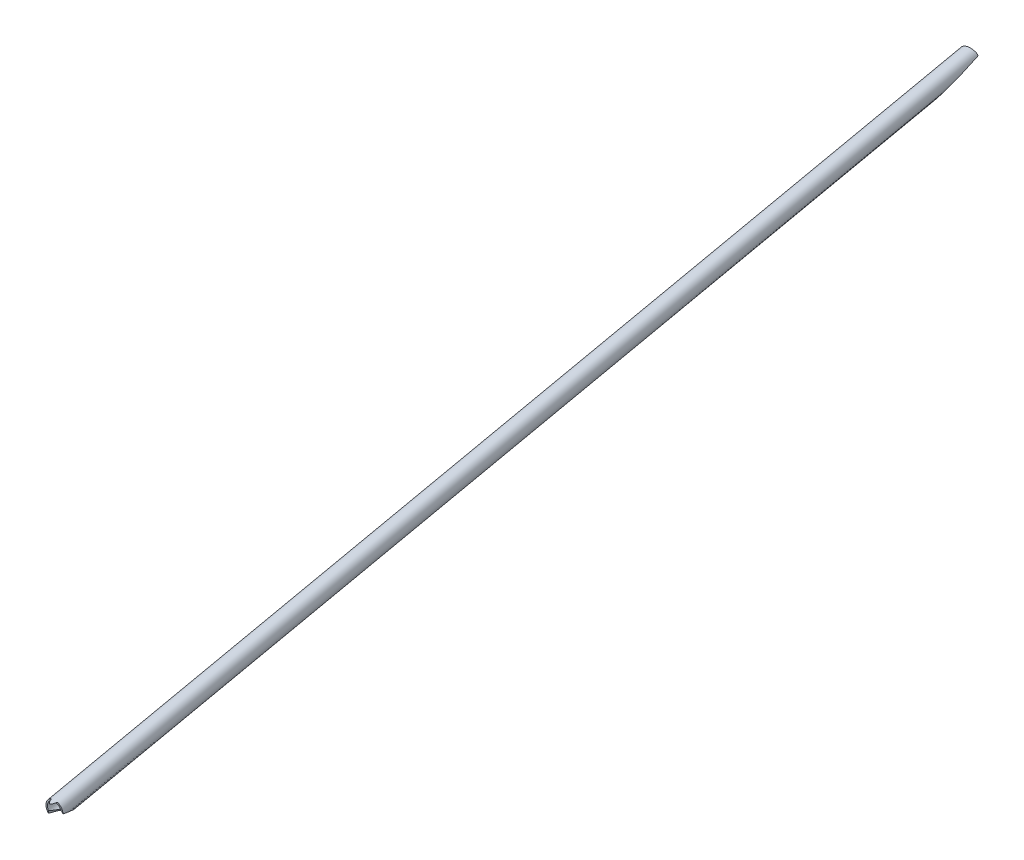
ISO-10303-21;
HEADER;
FILE_DESCRIPTION(('STEP AP214'),'2;1');
FILE_NAME('part.step','',(''),(''),'','','');
FILE_SCHEMA(('AUTOMOTIVE_DESIGN { 1 0 10303 214 1 1 1 1 }'));
ENDSEC;
DATA;
#1=APPLICATION_CONTEXT('core data for automotive mechanical design processes');
#2=APPLICATION_PROTOCOL_DEFINITION('international standard','automotive_design',2000,#1);
#3=PRODUCT_CONTEXT('',#1,'mechanical');
#4=PRODUCT('Part','Part','',(#3));
#5=PRODUCT_RELATED_PRODUCT_CATEGORY('part','',(#4));
#6=PRODUCT_DEFINITION_FORMATION('','',#4);
#7=PRODUCT_DEFINITION_CONTEXT('part definition',#1,'design');
#8=PRODUCT_DEFINITION('design','',#6,#7);
#9=PRODUCT_DEFINITION_SHAPE('','',#8);
#10=(LENGTH_UNIT() NAMED_UNIT(*) SI_UNIT(.MILLI.,.METRE.));
#11=(NAMED_UNIT(*) PLANE_ANGLE_UNIT() SI_UNIT($,.RADIAN.));
#12=(NAMED_UNIT(*) SI_UNIT($,.STERADIAN.) SOLID_ANGLE_UNIT());
#13=UNCERTAINTY_MEASURE_WITH_UNIT(LENGTH_MEASURE(1.E-05),#10,'distance_accuracy_value','');
#14=(GEOMETRIC_REPRESENTATION_CONTEXT(3) GLOBAL_UNCERTAINTY_ASSIGNED_CONTEXT((#13)) GLOBAL_UNIT_ASSIGNED_CONTEXT((#10,
#11,#12)) REPRESENTATION_CONTEXT('',''));
#15=CARTESIAN_POINT('',(0.,0.,0.));
#16=DIRECTION('',(0.,0.,1.));
#17=DIRECTION('',(1.,0.,0.));
#18=AXIS2_PLACEMENT_3D('',#15,#16,#17);
#19=CARTESIAN_POINT('',(-225.,200.,-450.));
#20=DIRECTION('',(-0.0876619818920292,0.105194378270435,-0.99058039537993));
#21=DIRECTION('',(0.,0.994408591727349,0.105600912395825));
#22=AXIS2_PLACEMENT_3D('',#19,#20,#21);
#23=CYLINDRICAL_SURFACE('',#22,7.90000000000002);
#24=CARTESIAN_POINT('',(-324.413759042427,327.152338725558,-1572.54122997149));
#25=CARTESIAN_POINT('',(-324.223825964413,327.150405834231,-1572.52303917828));
#26=CARTESIAN_POINT('',(-324.034192013295,327.141416851675,-1572.50176753112));
#27=CARTESIAN_POINT('',(-323.656939656688,327.10961498285,-1572.45211724596));
#28=CARTESIAN_POINT('',(-323.469322485104,327.086794074971,-1572.42373448959));
#29=CARTESIAN_POINT('',(-323.097251696187,327.02779010682,-1572.35877119607));
#30=CARTESIAN_POINT('',(-322.912804672793,326.991582063526,-1572.32217538223));
#31=CARTESIAN_POINT('',(-322.548955854034,326.906610235132,-1572.23977177553));
#32=CARTESIAN_POINT('',(-322.369553228048,326.857848530733,-1572.19396550952));
#33=CARTESIAN_POINT('',(-322.016975555681,326.748783349213,-1572.09209106659));
#34=CARTESIAN_POINT('',(-321.843809844812,326.688463360175,-1572.03600821383));
#35=CARTESIAN_POINT('',(-321.505369917444,326.557735702004,-1571.91284557862));
#36=CARTESIAN_POINT('',(-321.340095836092,326.487327860196,-1571.84576560793));
#37=CARTESIAN_POINT('',(-321.018781818506,326.338168494973,-1571.70021216618));
#38=CARTESIAN_POINT('',(-320.862734136102,326.259424130209,-1571.62174844934));
#39=CARTESIAN_POINT('',(-320.560616327028,326.095389020814,-1571.4533288758));
#40=CARTESIAN_POINT('',(-320.414546084991,326.010098351899,-1571.36337315201));
#41=CARTESIAN_POINT('',(-320.137185042642,325.837521196735,-1571.17525321891));
#42=CARTESIAN_POINT('',(-320.005579315826,325.750374967954,-1571.07742313229));
#43=CARTESIAN_POINT('',(-319.752300757524,325.573291959953,-1570.871971115));
#44=CARTESIAN_POINT('',(-319.630627700986,325.483355244024,-1570.7643494063));
#45=CARTESIAN_POINT('',(-319.396942383957,325.302066177897,-1570.54018422395));
#46=CARTESIAN_POINT('',(-319.284931180467,325.210713674099,-1570.42363977678));
#47=CARTESIAN_POINT('',(-319.070063725635,325.027709926413,-1570.1826414211));
#48=CARTESIAN_POINT('',(-318.9672084325,324.936058652296,-1570.05818668707));
#49=CARTESIAN_POINT('',(-318.686174802223,324.675692294438,-1569.69370787207));
#50=CARTESIAN_POINT('',(-318.518215036197,324.507635808557,-1569.44530108652));
#51=CARTESIAN_POINT('',(-318.206249483011,324.176555036927,-1568.93067111523));
#52=CARTESIAN_POINT('',(-318.06226523404,324.013535381885,-1568.66443220797));
#53=CARTESIAN_POINT('',(-317.860514204538,323.773296213011,-1568.25464848686));
#54=CARTESIAN_POINT('',(-317.795490119185,323.693738017998,-1568.11595637345));
#55=CARTESIAN_POINT('',(-317.669819177316,323.536202356653,-1567.83571301811));
#56=CARTESIAN_POINT('',(-317.60917236721,323.458224907087,-1567.6941617459));
#57=CARTESIAN_POINT('',(-317.491813738295,323.303880243082,-1567.40867508206));
#58=CARTESIAN_POINT('',(-317.43510014386,323.227512313017,-1567.26474080306));
#59=CARTESIAN_POINT('',(-317.325166072884,323.076304709172,-1566.97476077666));
#60=CARTESIAN_POINT('',(-317.271945534472,323.001465008339,-1566.82871506671));
#61=CARTESIAN_POINT('',(-317.121659240185,322.785878935921,-1566.40120373988));
#62=CARTESIAN_POINT('',(-317.028711983707,322.647060276453,-1566.11731298317));
#63=CARTESIAN_POINT('',(-316.852061184911,322.374181891733,-1565.5443908712));
#64=CARTESIAN_POINT('',(-316.768359385538,322.240123067022,-1565.25535855855));
#65=CARTESIAN_POINT('',(-316.608557963352,321.976116255558,-1564.67312514249));
#66=CARTESIAN_POINT('',(-316.532463127482,321.846170892046,-1564.37992154507));
#67=CARTESIAN_POINT('',(-316.386686179501,321.589918276203,-1563.79033635381));
#68=CARTESIAN_POINT('',(-316.317004505271,321.463611272696,-1563.49395454452));
#69=CARTESIAN_POINT('',(-316.182925567985,321.2138281703,-1562.89790382702));
#70=CARTESIAN_POINT('',(-316.11854206143,321.090360005716,-1562.59822851834));
#71=CARTESIAN_POINT('',(-315.994503809666,320.84613997225,-1561.99679550973));
#72=CARTESIAN_POINT('',(-315.934849215286,320.725388190096,-1561.6950377437));
#73=CARTESIAN_POINT('',(-315.762101850184,320.366704469121,-1560.78745106359));
#74=CARTESIAN_POINT('',(-315.655173684925,320.132246371002,-1560.17907325054));
#75=CARTESIAN_POINT('',(-315.45406034456,319.669308020439,-1558.95558254371));
#76=CARTESIAN_POINT('',(-315.359919686426,319.440850777552,-1558.34045379223));
#77=CARTESIAN_POINT('',(-315.182710126783,318.988823008115,-1557.10677292777));
#78=CARTESIAN_POINT('',(-315.09964206027,318.765252851168,-1556.48822056027));
#79=CARTESIAN_POINT('',(-314.943370987048,318.321890725559,-1555.24960616821));
#80=CARTESIAN_POINT('',(-314.870153185004,318.10209353305,-1554.62954786474));
#81=CARTESIAN_POINT('',(-314.73263336174,317.664788240817,-1553.38765994385));
#82=CARTESIAN_POINT('',(-314.668331115251,317.447280083385,-1552.76583037158));
#83=CARTESIAN_POINT('',(-314.549103597342,317.016843208253,-1551.53015185889));
#84=CARTESIAN_POINT('',(-314.49405297508,316.803894522887,-1550.91632193179));
#85=CARTESIAN_POINT('',(-314.392047243785,316.378553959499,-1549.68779283138));
#86=CARTESIAN_POINT('',(-314.345092188921,316.166162085212,-1549.07309365228));
#87=CARTESIAN_POINT('',(-314.259353365003,315.741160053211,-1547.8428385787));
#88=CARTESIAN_POINT('',(-314.220573884913,315.528549839431,-1547.22728240422));
#89=CARTESIAN_POINT('',(-314.151540884499,315.102605011086,-1545.99594440608));
#90=CARTESIAN_POINT('',(-314.121287315278,314.889270400684,-1545.38016258373));
#91=CARTESIAN_POINT('',(-314.069888498927,314.461416089725,-1544.14910263745));
#92=CARTESIAN_POINT('',(-314.048736992503,314.246897306648,-1543.53382445872));
#93=CARTESIAN_POINT('',(-314.016363365295,313.815899855934,-1542.30369526903));
#94=CARTESIAN_POINT('',(-314.005141134595,313.599421210019,-1541.68884425341));
#95=CARTESIAN_POINT('',(-313.993850813937,313.163896503057,-1540.4602462025));
#96=CARTESIAN_POINT('',(-313.993777761403,312.944851627677,-1539.84649879763));
#97=CARTESIAN_POINT('',(-314.006528132601,312.503278366729,-1538.62041664346));
#98=CARTESIAN_POINT('',(-314.019350898923,312.280750159306,-1538.00808182374));
#99=CARTESIAN_POINT('',(-314.060513273149,311.830117248397,-1536.78276811989));
#100=CARTESIAN_POINT('',(-314.088923347496,311.601991748718,-1536.16979902387));
#101=CARTESIAN_POINT('',(-314.146230482902,311.255182512355,-1535.25278759615));
#102=CARTESIAN_POINT('',(-314.16779107738,311.138770077302,-1534.94742375843));
#103=CARTESIAN_POINT('',(-314.21654717266,310.904172890537,-1534.33782952719));
#104=CARTESIAN_POINT('',(-314.243742536018,310.78598818212,-1534.03359910621));
#105=CARTESIAN_POINT('',(-314.304575490943,310.547977747905,-1533.42771975439));
#106=CARTESIAN_POINT('',(-314.338189058047,310.428159642197,-1533.12606544634));
#107=CARTESIAN_POINT('',(-314.41314832812,310.186076620357,-1532.52470927533));
#108=CARTESIAN_POINT('',(-314.454493576955,310.06381184831,-1532.22500729877));
#109=CARTESIAN_POINT('',(-314.546579826188,309.816438399291,-1531.62856343988));
#110=CARTESIAN_POINT('',(-314.597311651299,309.691332603263,-1531.3318189626));
#111=CARTESIAN_POINT('',(-314.710624357681,309.437498439586,-1530.74219714993));
#112=CARTESIAN_POINT('',(-314.773201569829,309.308771204165,-1530.449318647));
#113=CARTESIAN_POINT('',(-314.877036561337,309.115570051723,-1530.02185468084));
#114=CARTESIAN_POINT('',(-314.912212567331,309.052886142503,-1529.88497957472));
#115=CARTESIAN_POINT('',(-314.986713096584,308.926321023218,-1529.61289007729));
#116=CARTESIAN_POINT('',(-315.026038106737,308.862439673355,-1529.47767588297));
#117=CARTESIAN_POINT('',(-315.10967435957,308.733183434357,-1529.20911891652));
#118=CARTESIAN_POINT('',(-315.153996289689,308.667805591801,-1529.0757808689));
#119=CARTESIAN_POINT('',(-315.248558421596,308.535502342074,-1528.81200937035));
#120=CARTESIAN_POINT('',(-315.29879735669,308.468577268587,-1528.68157530484));
#121=CARTESIAN_POINT('',(-315.394487924812,308.348158741477,-1528.45351145674));
#122=CARTESIAN_POINT('',(-315.438484918824,308.295020436426,-1528.35508715781));
#123=CARTESIAN_POINT('',(-315.531730244962,308.187567110818,-1528.16143112148));
#124=CARTESIAN_POINT('',(-315.580977081752,308.133252428827,-1528.06619848509));
#125=CARTESIAN_POINT('',(-315.685669042602,308.023525730026,-1527.88036638838));
#126=CARTESIAN_POINT('',(-315.741092059163,307.968118176423,-1527.7897519937));
#127=CARTESIAN_POINT('',(-315.859664961843,307.856040582261,-1527.61462808119));
#128=CARTESIAN_POINT('',(-315.922806217684,307.799372008711,-1527.53011190976));
#129=CARTESIAN_POINT('',(-316.048531924634,307.693424904593,-1527.38182838375));
#130=CARTESIAN_POINT('',(-316.109796055946,307.644304129007,-1527.31684616022));
#131=CARTESIAN_POINT('',(-316.240550498867,307.545554446691,-1527.19584599915));
#132=CARTESIAN_POINT('',(-316.310046936893,307.495925186961,-1527.13983481162));
#133=CARTESIAN_POINT('',(-316.459282925142,307.396342457874,-1527.03988795759));
#134=CARTESIAN_POINT('',(-316.539159503963,307.346395152711,-1526.99614437416));
#135=CARTESIAN_POINT('',(-316.707763087429,307.248929180535,-1526.92698411045));
#136=CARTESIAN_POINT('',(-316.796459648679,307.20140296087,-1526.90150672186));
#137=CARTESIAN_POINT('',(-316.968602970586,307.116845436161,-1526.87442419955));
#138=CARTESIAN_POINT('',(-317.051363493557,307.079241578787,-1526.87027881649));
#139=CARTESIAN_POINT('',(-317.218227962278,307.009368603702,-1526.87922900515));
#140=CARTESIAN_POINT('',(-317.302333213553,306.977105064995,-1526.89234248072));
#141=CARTESIAN_POINT('',(-317.477267084163,306.915530996066,-1526.93571877402));
#142=CARTESIAN_POINT('',(-317.567905302545,306.886858396065,-1526.96759599055));
#143=CARTESIAN_POINT('',(-317.744900936362,306.836181566033,-1527.04530136005));
#144=CARTESIAN_POINT('',(-317.831250213811,306.814189635991,-1527.0911549382));
#145=CARTESIAN_POINT('',(-318.057943898887,306.762322797443,-1527.22858757717));
#146=CARTESIAN_POINT('',(-318.193666522569,306.737742547625,-1527.32967656005));
#147=CARTESIAN_POINT('',(-318.387584101299,306.709360154106,-1527.49364458997));
#148=CARTESIAN_POINT('',(-318.450720240115,306.70130701791,-1527.55047321619));
#149=CARTESIAN_POINT('',(-318.574132781804,306.687596432797,-1527.66743804739));
#150=CARTESIAN_POINT('',(-318.634410092226,306.681938219019,-1527.72757318942));
#151=CARTESIAN_POINT('',(-318.783121351149,306.670212073596,-1527.88239238101));
#152=CARTESIAN_POINT('',(-318.869882879095,306.665463429295,-1527.97876925));
#153=CARTESIAN_POINT('',(-319.038493399758,306.659629919682,-1528.17586193258));
#154=CARTESIAN_POINT('',(-319.120339919408,306.658546883858,-1528.2765798874));
#155=CARTESIAN_POINT('',(-319.359953919721,306.659700896019,-1528.58388911758));
#156=CARTESIAN_POINT('',(-319.511494248464,306.666359867283,-1528.79530726028));
#157=CARTESIAN_POINT('',(-319.803171696346,306.687844323292,-1529.22704426346));
#158=CARTESIAN_POINT('',(-319.943237589449,306.702716943419,-1529.4474076309));
#159=CARTESIAN_POINT('',(-320.146098393716,306.729593786003,-1529.78174984581));
#160=CARTESIAN_POINT('',(-320.212476397984,306.739307188607,-1529.89376491585));
#161=CARTESIAN_POINT('',(-320.343105190302,306.760078068857,-1530.11890098712));
#162=CARTESIAN_POINT('',(-320.407356032577,306.771135512208,-1530.23202196006));
#163=CARTESIAN_POINT('',(-320.609638259925,306.808357779528,-1530.5949748049));
#164=CARTESIAN_POINT('',(-320.744058492205,306.836781773406,-1530.84659123699));
#165=CARTESIAN_POINT('',(-321.0055766649,306.898129838468,-1531.35307726706));
#166=CARTESIAN_POINT('',(-321.132673330788,306.931054689597,-1531.60794742192));
#167=CARTESIAN_POINT('',(-321.380851694062,307.000613033654,-1532.12026648891));
#168=CARTESIAN_POINT('',(-321.50193002297,307.037248569381,-1532.37771675039));
#169=CARTESIAN_POINT('',(-321.738930370634,307.113634561893,-1532.89452745652));
#170=CARTESIAN_POINT('',(-321.854852102822,307.153385191455,-1533.1538880064));
#171=CARTESIAN_POINT('',(-322.196546069121,307.276837276603,-1533.93550413299));
#172=CARTESIAN_POINT('',(-322.415650233888,307.364564859934,-1534.46004219592));
#173=CARTESIAN_POINT('',(-322.84008421407,307.548335432225,-1535.51295767924));
#174=CARTESIAN_POINT('',(-323.045418295112,307.644375824769,-1536.04133385393));
#175=CARTESIAN_POINT('',(-323.44506846405,307.843400312654,-1537.10108333821));
#176=CARTESIAN_POINT('',(-323.639381698567,307.946386191261,-1537.63245738516));
#177=CARTESIAN_POINT('',(-324.018813049677,308.158341491478,-1538.69732254871));
#178=CARTESIAN_POINT('',(-324.203930478969,308.267311359059,-1539.23081382035));
#179=CARTESIAN_POINT('',(-324.566070143833,308.49044858925,-1540.29858278223));
#180=CARTESIAN_POINT('',(-324.743103338159,308.604608470276,-1540.83285832936));
#181=CARTESIAN_POINT('',(-325.090391075355,308.837863862448,-1541.90253575853));
#182=CARTESIAN_POINT('',(-325.260645535445,308.956959433831,-1542.43793765423));
#183=CARTESIAN_POINT('',(-325.620429215489,309.218162124749,-1543.59037404389));
#184=CARTESIAN_POINT('',(-325.808991151018,309.361030181444,-1544.20753781788));
#185=CARTESIAN_POINT('',(-326.179207709245,309.652820127847,-1545.44250928842));
#186=CARTESIAN_POINT('',(-326.360862251357,309.801742088141,-1546.06031699239));
#187=CARTESIAN_POINT('',(-326.71812998668,310.10575628777,-1547.29648689167));
#188=CARTESIAN_POINT('',(-326.893740341658,310.260851354105,-1547.91484921125));
#189=CARTESIAN_POINT('',(-327.239472516441,310.577393036615,-1549.15147764168));
#190=CARTESIAN_POINT('',(-327.409594369632,310.738839614141,-1549.76974375309));
#191=CARTESIAN_POINT('',(-327.744565354969,311.068244086461,-1551.00463955678));
#192=CARTESIAN_POINT('',(-327.909423802897,311.236189162685,-1551.62127013968));
#193=CARTESIAN_POINT('',(-328.23463566417,311.579605942342,-1552.85362193044));
#194=CARTESIAN_POINT('',(-328.394989102148,311.755077604606,-1553.46934314327));
#195=CARTESIAN_POINT('',(-328.711497761121,312.11457956269,-1554.69918984474));
#196=CARTESIAN_POINT('',(-328.86765403539,312.298607679024,-1555.31331569812));
#197=CARTESIAN_POINT('',(-329.176051107185,312.676801167863,-1556.5394154498));
#198=CARTESIAN_POINT('',(-329.328292031356,312.870966211859,-1557.15138941715));
#199=CARTESIAN_POINT('',(-329.620085662264,313.259846142435,-1558.33621332896));
#200=CARTESIAN_POINT('',(-329.759857020913,313.453852689742,-1558.90924129523));
#201=CARTESIAN_POINT('',(-330.035925117012,313.855496070577,-1560.05148194859));
#202=CARTESIAN_POINT('',(-330.172221380426,314.063134749992,-1560.62069410744));
#203=CARTESIAN_POINT('',(-330.373715865643,314.387798259966,-1561.47048506748));
#204=CARTESIAN_POINT('',(-330.440420038697,314.498275988995,-1561.75321090346));
#205=CARTESIAN_POINT('',(-330.572689579465,314.724269689525,-1562.31690647304));
#206=CARTESIAN_POINT('',(-330.638254979625,314.839785517148,-1562.59787625653));
#207=CARTESIAN_POINT('',(-330.768046681965,315.076605887011,-1563.15761039922));
#208=CARTESIAN_POINT('',(-330.83227327212,315.197909165527,-1563.43637522453));
#209=CARTESIAN_POINT('',(-330.959112416612,315.447276562297,-1563.99123139784));
#210=CARTESIAN_POINT('',(-331.021725019412,315.5753404772,-1564.26732282595));
#211=CARTESIAN_POINT('',(-331.158670624781,315.868849942233,-1564.87741748251));
#212=CARTESIAN_POINT('',(-331.232501434142,316.036260450486,-1565.21059651586));
#213=CARTESIAN_POINT('',(-331.375918221963,316.385511010636,-1565.87018788746));
#214=CARTESIAN_POINT('',(-331.445505111538,316.567347945945,-1566.19660166813));
#215=CARTESIAN_POINT('',(-331.578457949839,316.948578157969,-1566.83995561246));
#216=CARTESIAN_POINT('',(-331.641831065592,317.147950692985,-1567.1569063901));
#217=CARTESIAN_POINT('',(-331.729884547661,317.463122138689,-1567.62265756846));
#218=CARTESIAN_POINT('',(-331.75806410364,317.570846402953,-1567.77627191449));
#219=CARTESIAN_POINT('',(-331.811519508807,317.792194102174,-1568.07969704189));
#220=CARTESIAN_POINT('',(-331.836795697765,317.90581684459,-1568.22950826673));
#221=CARTESIAN_POINT('',(-331.888968309762,318.165332797967,-1568.55732418967));
#222=CARTESIAN_POINT('',(-331.914985282809,318.312802675801,-1568.73423073898));
#223=CARTESIAN_POINT('',(-331.960105556466,318.618032152416,-1569.07981348046));
#224=CARTESIAN_POINT('',(-331.979211166265,318.775788293574,-1569.24849240528));
#225=CARTESIAN_POINT('',(-332.008555967966,319.101823369841,-1569.57568923057));
#226=CARTESIAN_POINT('',(-332.018809866054,319.270084351473,-1569.73422357778));
#227=CARTESIAN_POINT('',(-332.028239029508,319.617244231617,-1570.0395726226));
#228=CARTESIAN_POINT('',(-332.027416932664,319.796140587169,-1570.18639010224));
#229=CARTESIAN_POINT('',(-332.013571799115,320.1317830993,-1570.44228726827));
#230=CARTESIAN_POINT('',(-332.002688486544,320.286993159046,-1570.55349691687));
#231=CARTESIAN_POINT('',(-331.970338387465,320.603023372119,-1570.76593682062));
#232=CARTESIAN_POINT('',(-331.948873945334,320.763842275408,-1570.86716928037));
#233=CARTESIAN_POINT('',(-331.894169975389,321.089674213252,-1571.05917662485));
#234=CARTESIAN_POINT('',(-331.860930866607,321.25468709836,-1571.14995188157));
#235=CARTESIAN_POINT('',(-331.781751711322,321.587137347397,-1571.32093382684));
#236=CARTESIAN_POINT('',(-331.735811373621,321.754574766829,-1571.40114027303));
#237=CARTESIAN_POINT('',(-331.63056904198,322.09013655761,-1571.55136040974));
#238=CARTESIAN_POINT('',(-331.571247831379,322.258261572069,-1571.62135920031));
#239=CARTESIAN_POINT('',(-331.439049272357,322.59293989146,-1571.7516340307));
#240=CARTESIAN_POINT('',(-331.366171620598,322.759493161136,-1571.8119098529));
#241=CARTESIAN_POINT('',(-331.2069026608,323.089204132709,-1571.92361303523));
#242=CARTESIAN_POINT('',(-331.120502600998,323.252359557475,-1571.97503461927));
#243=CARTESIAN_POINT('',(-330.934579776459,323.57340838702,-1572.06994087854));
#244=CARTESIAN_POINT('',(-330.835056950147,323.731301767104,-1572.11342551652));
#245=CARTESIAN_POINT('',(-330.625312413433,324.037552035158,-1572.19272620809));
#246=CARTESIAN_POINT('',(-330.515310066445,324.18602792208,-1572.22866386044));
#247=CARTESIAN_POINT('',(-330.283844205023,324.475127572026,-1572.29468564117));
#248=CARTESIAN_POINT('',(-330.162380925206,324.615751495693,-1572.32476988933));
#249=CARTESIAN_POINT('',(-329.908760514784,324.888033216832,-1572.3798486555));
#250=CARTESIAN_POINT('',(-329.776604551875,325.019691990458,-1572.40484372822));
#251=CARTESIAN_POINT('',(-329.50240542436,325.273114372099,-1572.45038840332));
#252=CARTESIAN_POINT('',(-329.360361781151,325.394877500504,-1572.4709377903));
#253=CARTESIAN_POINT('',(-329.057568412556,325.635379839772,-1572.50932096465));
#254=CARTESIAN_POINT('',(-328.896202832368,325.753387512166,-1572.52688556608));
#255=CARTESIAN_POINT('',(-328.564325940845,325.976362847728,-1572.5579628974));
#256=CARTESIAN_POINT('',(-328.393814173041,326.081329859192,-1572.57147542484));
#257=CARTESIAN_POINT('',(-328.044639118845,326.277579119328,-1572.59470345302));
#258=CARTESIAN_POINT('',(-327.865968638406,326.368848974126,-1572.60441552753));
#259=CARTESIAN_POINT('',(-327.501818638859,326.53697062766,-1572.62008718438));
#260=CARTESIAN_POINT('',(-327.316339334427,326.613822880506,-1572.62604688492));
#261=CARTESIAN_POINT('',(-326.93368214498,326.754861218198,-1572.63422492544));
#262=CARTESIAN_POINT('',(-326.736319952857,326.818555274042,-1572.63631556253));
#263=CARTESIAN_POINT('',(-326.337053965098,326.929603732655,-1572.63603123546));
#264=CARTESIAN_POINT('',(-326.135150248509,326.976958419576,-1572.63365634897));
#265=CARTESIAN_POINT('',(-325.728787437235,327.054936408205,-1572.62390551472));
#266=CARTESIAN_POINT('',(-325.524335980639,327.085601185689,-1572.61654206723));
#267=CARTESIAN_POINT('',(-325.113997320353,327.130222335702,-1572.59607661585));
#268=CARTESIAN_POINT('',(-324.908111222263,327.144190392912,-1572.58297863387));
#269=CARTESIAN_POINT('',(-324.654227768868,327.151167019589,-1572.56269894093));
#270=CARTESIAN_POINT('',(-324.606117908202,327.152034644155,-1572.55867296441));
#271=CARTESIAN_POINT('',(-324.509918657255,327.152865141856,-1572.55024045631));
#272=CARTESIAN_POINT('',(-324.461829269596,327.15282792168,-1572.54583388552));
#273=CARTESIAN_POINT('',(-324.413759042427,327.152338725558,-1572.54122997149));
#274=B_SPLINE_CURVE_WITH_KNOTS('',3,(#24,#25,#26,#27,#28,#29,#30,#31,#32,#33,#34,#35,#36,#37,
#38,#39,#40,#41,#42,#43,#44,#45,#46,#47,#48,#49,#50,#51,#52,#53,#54,#55,#56,#57,#58,#59,#60,#61,
#62,#63,#64,#65,#66,#67,#68,#69,#70,#71,#72,#73,#74,#75,#76,#77,#78,#79,#80,#81,#82,#83,#84,#85,
#86,#87,#88,#89,#90,#91,#92,#93,#94,#95,#96,#97,#98,#99,#100,#101,#102,#103,#104,#105,#106,#107,
#108,#109,#110,#111,#112,#113,#114,#115,#116,#117,#118,#119,#120,#121,#122,#123,#124,#125,#126,
#127,#128,#129,#130,#131,#132,#133,#134,#135,#136,#137,#138,#139,#140,#141,#142,#143,#144,#145,
#146,#147,#148,#149,#150,#151,#152,#153,#154,#155,#156,#157,#158,#159,#160,#161,#162,#163,#164,
#165,#166,#167,#168,#169,#170,#171,#172,#173,#174,#175,#176,#177,#178,#179,#180,#181,#182,#183,
#184,#185,#186,#187,#188,#189,#190,#191,#192,#193,#194,#195,#196,#197,#198,#199,#200,#201,#202,
#203,#204,#205,#206,#207,#208,#209,#210,#211,#212,#213,#214,#215,#216,#217,#218,#219,#220,#221,
#222,#223,#224,#225,#226,#227,#228,#229,#230,#231,#232,#233,#234,#235,#236,#237,#238,#239,#240,
#241,#242,#243,#244,#245,#246,#247,#248,#249,#250,#251,#252,#253,#254,#255,#256,#257,#258,#259,
#260,#261,#262,#263,#264,#265,#266,#267,#268,#269,#270,#271,#272,#273),.UNSPECIFIED.,.T.,.F.,(4,
2,2,2,2,2,2,2,2,2,2,2,2,2,2,2,2,2,2,2,2,2,2,2,2,2,2,2,2,2,2,2,2,2,2,2,2,2,2,2,2,2,2,2,2,2,2,2,2,
2,2,2,2,2,2,2,2,2,2,2,2,2,2,2,2,2,2,2,2,2,2,2,2,2,2,2,2,2,2,2,2,2,2,2,2,2,2,2,2,2,2,2,2,2,2,2,2,
2,2,2,2,2,2,2,2,2,2,2,2,2,2,2,2,2,2,2,2,2,2,2,2,2,2,2,4),(0.,0.572391920039854,1.14511610786385,
1.71891455112991,2.2926179516676,2.86714712669978,3.44168613718166,4.01573572693711,
4.58977867805109,5.1463098589185,5.70282842658562,6.25940780004329,6.81604535361012,
7.845434232104,8.87574292137974,9.39349319081042,9.91124894895653,10.4287694271829,
10.9462807363878,11.934196937572,12.9222990631775,13.9110191227719,14.8998066404482,
15.8910854249245,16.8823958132957,18.8642362925616,20.8528083668503,22.8415303164947,
24.8272309881016,26.8128814778897,28.7689698178878,30.7250712458829,32.6821963185119,
34.6393101665431,36.5950759901461,38.5508201633061,40.5056938185601,42.4604678222284,
44.424152584114,45.4066438259338,46.3891111052819,47.3679704821708,48.3467723819893,
49.324622519158,50.3021702602598,50.7659194149984,51.2297230523756,51.6945381997414,
52.1592540212165,52.5197109055163,52.8800653922003,53.2391690925357,53.5978748664229,
53.9031043214651,54.2085623699768,54.5185655819111,54.8275336506459,55.0986843527488,
55.3701165607455,55.669264833343,55.9689605848146,56.4789227768818,56.7348544560793,
56.9907043371587,57.3797063776148,57.7689025385701,58.5486279181778,59.3328750890408,
59.7245505824835,60.1162160836683,60.976054829361,61.8360427644022,62.6965067385599,
63.5570184718262,65.2822325190209,67.0069096458011,68.7320312852011,70.4572816683599,
72.180119362413,73.9029780890829,75.8857632674283,77.8685715712046,79.8522986006732,
81.8360135611052,83.8159972772328,85.7959701649926,87.7754414512674,89.7548486283851,
91.6174699348626,93.4803439757626,94.4126675189099,95.3449644541766,96.2770587405195,
97.2091250066551,98.3491673872391,99.4889641478437,100.627430397499,101.196483412489,
101.765469765384,102.460381097574,103.155060034781,103.848582602634,104.541940008333,
105.115104628792,105.688142314734,106.261159609734,106.834190043346,107.408048722215,
107.981920243252,108.556164724208,109.130411899788,109.694542829786,110.258662213961,
110.822720076428,111.38680526065,111.988166114881,112.589557009859,113.191488834287,
113.793401696551,114.414849571347,115.036286638226,115.656172249357,116.275623798358,
116.420475726082,116.56534259137),.UNSPECIFIED.);
#275=CARTESIAN_POINT('',(-324.413759042427,327.152338725558,-1572.54122997149));
#276=VERTEX_POINT('',#275);
#277=EDGE_CURVE('E112',#276,#276,#274,.T.);
#278=ORIENTED_EDGE('',*,*,#277,.T.);
#279=EDGE_LOOP('',(#278));
#280=FACE_BOUND('',#279,.T.);
#281=CARTESIAN_POINT('',(-225.462747942323,208.411125405434,-454.394804540324));
#282=CARTESIAN_POINT('',(-225.683947773777,208.409238568169,-454.377046452677));
#283=CARTESIAN_POINT('',(-225.9052195311,208.398113504627,-454.360885952007));
#284=CARTESIAN_POINT('',(-226.34624122031,208.357368509407,-454.331011519702));
#285=CARTESIAN_POINT('',(-226.565990915251,208.327745760771,-454.317297961114));
#286=CARTESIAN_POINT('',(-227.002435951544,208.250129790525,-454.291782234907));
#287=CARTESIAN_POINT('',(-227.219129938478,208.202128672748,-454.279980891967));
#288=CARTESIAN_POINT('',(-227.647779061229,208.088052372666,-454.257953074507));
#289=CARTESIAN_POINT('',(-227.859734387717,208.021977919007,-454.247726536522));
#290=CARTESIAN_POINT('',(-228.277367983228,207.872203235647,-454.22867600165));
#291=CARTESIAN_POINT('',(-228.483046795016,207.788504534985,-454.21985188321));
#292=CARTESIAN_POINT('',(-228.886675333695,207.604065155909,-454.203593766928));
#293=CARTESIAN_POINT('',(-229.084624985566,207.503324312135,-454.196159782576));
#294=CARTESIAN_POINT('',(-229.471355463309,207.285549839047,-454.182829788207));
#295=CARTESIAN_POINT('',(-229.66013796176,207.168519197043,-454.176933496767));
#296=CARTESIAN_POINT('',(-230.02725477896,206.919012985531,-454.166984379286));
#297=CARTESIAN_POINT('',(-230.205589126072,206.786537457956,-454.16293154824));
#298=CARTESIAN_POINT('',(-230.550436275743,206.507250989659,-454.157150005181));
#299=CARTESIAN_POINT('',(-230.716959283182,206.36045269077,-454.155419263156));
#300=CARTESIAN_POINT('',(-231.037239701548,206.053526901845,-454.154940286201));
#301=CARTESIAN_POINT('',(-231.190997004175,205.893399298751,-454.156192076571));
#302=CARTESIAN_POINT('',(-231.48483105785,205.560931500349,-454.162559692283));
#303=CARTESIAN_POINT('',(-231.624898834243,205.388583419519,-454.167678033542));
#304=CARTESIAN_POINT('',(-231.890338369045,205.033124801574,-454.182913687227));
#305=CARTESIAN_POINT('',(-232.015710337458,204.85001441831,-454.193030928207));
#306=CARTESIAN_POINT('',(-232.250972506364,204.474544430157,-454.219691155432));
#307=CARTESIAN_POINT('',(-232.360863070104,204.282185042422,-454.236233990877));
#308=CARTESIAN_POINT('',(-232.564514733846,203.88990727729,-454.277517897782));
#309=CARTESIAN_POINT('',(-232.658274149619,203.689988113242,-454.30225982451));
#310=CARTESIAN_POINT('',(-232.82902591216,203.28488236339,-454.362046974955));
#311=CARTESIAN_POINT('',(-232.906038971778,203.079702639539,-454.397079343262));
#312=CARTESIAN_POINT('',(-233.043105587462,202.666302689569,-454.479947039236));
#313=CARTESIAN_POINT('',(-233.103165649295,202.458083662141,-454.527777441854));
#314=CARTESIAN_POINT('',(-233.192692170289,202.096686856929,-454.624219721212));
#315=CARTESIAN_POINT('',(-233.226048896418,201.943514158047,-454.669280359135));
#316=CARTESIAN_POINT('',(-233.283751796854,201.638547903211,-454.768812541406));
#317=CARTESIAN_POINT('',(-233.308100260897,201.486754006373,-454.82328168911));
#318=CARTESIAN_POINT('',(-233.348080647459,201.186323337314,-454.942410759108));
#319=CARTESIAN_POINT('',(-233.363726915108,201.037681760139,-455.007053683356));
#320=CARTESIAN_POINT('',(-233.38689228684,200.744917211457,-455.147156503907));
#321=CARTESIAN_POINT('',(-233.3944113749,200.600794248857,-455.222616421535));
#322=CARTESIAN_POINT('',(-233.402069351253,200.318270756709,-455.384672208408));
#323=CARTESIAN_POINT('',(-233.402190031111,200.179885183144,-455.471295026527));
#324=CARTESIAN_POINT('',(-233.395924643291,199.910519196218,-455.655144245054));
#325=CARTESIAN_POINT('',(-233.389538700403,199.779538640885,-455.752370442066));
#326=CARTESIAN_POINT('',(-233.371268265484,199.525794956057,-455.956646810515));
#327=CARTESIAN_POINT('',(-233.35938086648,199.403036210274,-456.063702151672));
#328=CARTESIAN_POINT('',(-233.331106839962,199.166177045377,-456.286472032384));
#329=CARTESIAN_POINT('',(-233.314718721766,199.05207951095,-456.402189431642));
#330=CARTESIAN_POINT('',(-233.270250624134,198.783556898241,-456.694278222073));
#331=CARTESIAN_POINT('',(-233.240215824562,198.633839272652,-456.874684836281));
#332=CARTESIAN_POINT('',(-233.17486318857,198.351153450948,-457.247262107032));
#333=CARTESIAN_POINT('',(-233.139542272528,198.218195102308,-457.439439582313));
#334=CARTESIAN_POINT('',(-233.064983944159,197.966538469602,-457.833227557472));
#335=CARTESIAN_POINT('',(-233.025731271161,197.84790002761,-458.034873061633));
#336=CARTESIAN_POINT('',(-232.944400485674,197.623402924915,-458.444471132733));
#337=CARTESIAN_POINT('',(-232.902322985866,197.517541506832,-458.65242232669));
#338=CARTESIAN_POINT('',(-232.794390234548,197.266540066994,-459.177674135959));
#339=CARTESIAN_POINT('',(-232.727127111686,197.128086279059,-459.497868492492));
#340=CARTESIAN_POINT('',(-232.588384881899,196.869950393538,-460.144915796728));
#341=CARTESIAN_POINT('',(-232.516903335855,196.750279305488,-460.471772523728));
#342=CARTESIAN_POINT('',(-232.369776503521,196.525695877709,-461.130339767874));
#343=CARTESIAN_POINT('',(-232.294122889038,196.420814662667,-461.462058945881));
#344=CARTESIAN_POINT('',(-232.138667214851,196.223356222043,-462.128060032869));
#345=CARTESIAN_POINT('',(-232.058866062377,196.130776321309,-462.462341367883));
#346=CARTESIAN_POINT('',(-231.894476733214,195.955613120131,-463.133726562422));
#347=CARTESIAN_POINT('',(-231.809871901039,195.873068166117,-463.470836291943));
#348=CARTESIAN_POINT('',(-231.635709789061,195.716991448121,-464.145872823519));
#349=CARTESIAN_POINT('',(-231.546152249194,195.643460158097,-464.483799667586));
#350=CARTESIAN_POINT('',(-231.361686406407,195.504562880185,-465.159388816412));
#351=CARTESIAN_POINT('',(-231.266785061824,195.439186614617,-465.497050910128));
#352=CARTESIAN_POINT('',(-231.070924545007,195.315897757958,-466.171960520331));
#353=CARTESIAN_POINT('',(-230.969965623226,195.257984858601,-466.50920805337));
#354=CARTESIAN_POINT('',(-230.709028842493,195.122054296145,-467.351423127929));
#355=CARTESIAN_POINT('',(-230.544812851869,195.048490949941,-467.855811072576));
#356=CARTESIAN_POINT('',(-230.198087589993,194.91721887053,-468.860719236705));
#357=CARTESIAN_POINT('',(-230.015569076645,194.859518202969,-469.361237363277));
#358=CARTESIAN_POINT('',(-229.725236322343,194.785829593863,-470.106297854582));
#359=CARTESIAN_POINT('',(-229.62579369782,194.763424437318,-470.353485011773));
#360=CARTESIAN_POINT('',(-229.420671150586,194.723167540899,-470.845623981013));
#361=CARTESIAN_POINT('',(-229.314991722228,194.705315440727,-471.090575968459));
#362=CARTESIAN_POINT('',(-229.096666921815,194.674565606872,-471.577488767619));
#363=CARTESIAN_POINT('',(-228.98402618869,194.661664614293,-471.819451445072));
#364=CARTESIAN_POINT('',(-228.750746903514,194.641349465526,-472.299701019886));
#365=CARTESIAN_POINT('',(-228.630109567731,194.633934477002,-472.537988469478));
#366=CARTESIAN_POINT('',(-228.378753779296,194.625305922409,-473.011386720443));
#367=CARTESIAN_POINT('',(-228.247973139953,194.624134282367,-473.246465497425));
#368=CARTESIAN_POINT('',(-227.975402296331,194.629152399989,-473.710265566178));
#369=CARTESIAN_POINT('',(-227.833607528988,194.63534522406,-473.938984169118));
#370=CARTESIAN_POINT('',(-227.537645289286,194.65650904943,-474.386588889625));
#371=CARTESIAN_POINT('',(-227.383531138157,194.671443819423,-474.605511598746));
#372=CARTESIAN_POINT('',(-227.060057274017,194.712051689943,-475.030587934247));
#373=CARTESIAN_POINT('',(-226.890715136526,194.737712532614,-475.236755829166));
#374=CARTESIAN_POINT('',(-226.567891223526,194.79637189513,-475.592682114937));
#375=CARTESIAN_POINT('',(-226.417594912322,194.827019808665,-475.745676492703));
#376=CARTESIAN_POINT('',(-226.103215472083,194.899155096497,-476.034603719984));
#377=CARTESIAN_POINT('',(-225.939116896354,194.940654727912,-476.170517017579));
#378=CARTESIAN_POINT('',(-225.593719259438,195.037478213488,-476.419370083228));
#379=CARTESIAN_POINT('',(-225.412213946979,195.092985074332,-476.531966647403));
#380=CARTESIAN_POINT('',(-225.130367161098,195.187566970378,-476.673490011491));
#381=CARTESIAN_POINT('',(-225.034918395259,195.220942938053,-476.716074156868));
#382=CARTESIAN_POINT('',(-224.841414003122,195.29151584275,-476.79080440194));
#383=CARTESIAN_POINT('',(-224.743359726551,195.328710828951,-476.822955796289));
#384=CARTESIAN_POINT('',(-224.501996352637,195.424015861929,-476.887106940483));
#385=CARTESIAN_POINT('',(-224.357734089939,195.484134595718,-476.912832350868));
#386=CARTESIAN_POINT('',(-224.06977810401,195.61075155917,-476.937669492723));
#387=CARTESIAN_POINT('',(-223.926084217839,195.677247797974,-476.936789502787));
#388=CARTESIAN_POINT('',(-223.643810880774,195.814366146455,-476.909061947737));
#389=CARTESIAN_POINT('',(-223.505218736376,195.884976701707,-476.882284094961));
#390=CARTESIAN_POINT('',(-223.235725276621,196.028377484928,-476.805872354206));
#391=CARTESIAN_POINT('',(-223.104830859915,196.101169582387,-476.756218306403));
#392=CARTESIAN_POINT('',(-222.786169676113,196.28546683023,-476.607203397651));
#393=CARTESIAN_POINT('',(-222.604452976695,196.397312418192,-476.495427442054));
#394=CARTESIAN_POINT('',(-222.262219060807,196.619005263968,-476.241547288288));
#395=CARTESIAN_POINT('',(-222.101766620578,196.728845574951,-476.09935372046));
#396=CARTESIAN_POINT('',(-221.811881559351,196.936559499304,-475.806609987781));
#397=CARTESIAN_POINT('',(-221.680992523154,197.034685631701,-475.657648540164));
#398=CARTESIAN_POINT('',(-221.432789095077,197.228153605247,-475.34702116247));
#399=CARTESIAN_POINT('',(-221.315487217464,197.323492820074,-475.18534374701));
#400=CARTESIAN_POINT('',(-221.092361742156,197.511629010338,-474.852401320825));
#401=CARTESIAN_POINT('',(-220.986560119062,197.604420874061,-474.681118871287));
#402=CARTESIAN_POINT('',(-220.785074990715,197.787487861069,-474.331569664283));
#403=CARTESIAN_POINT('',(-220.689387717802,197.877763912216,-474.153305541691));
#404=CARTESIAN_POINT('',(-220.46318427221,198.098632871496,-473.705021515356));
#405=CARTESIAN_POINT('',(-220.337811264454,198.227928734625,-473.431773448956));
#406=CARTESIAN_POINT('',(-220.102779478928,198.482564636011,-472.876741316271));
#407=CARTESIAN_POINT('',(-219.993128239099,198.607902754385,-472.594953233312));
#408=CARTESIAN_POINT('',(-219.787069907394,198.855515701641,-472.024600344728));
#409=CARTESIAN_POINT('',(-219.69068783877,198.977784396655,-471.736023905166));
#410=CARTESIAN_POINT('',(-219.509695920305,199.219622082867,-471.15418041801));
#411=CARTESIAN_POINT('',(-219.425084090323,199.339191525325,-470.860914168674));
#412=CARTESIAN_POINT('',(-219.26575761539,199.577080317465,-470.268580191384));
#413=CARTESIAN_POINT('',(-219.191119630026,199.695384196201,-469.96948575431));
#414=CARTESIAN_POINT('',(-219.051510689688,199.930384513294,-469.368421857862));
#415=CARTESIAN_POINT('',(-218.986540096147,200.047080891403,-469.066452291445));
#416=CARTESIAN_POINT('',(-218.865656648271,200.279230553922,-468.460692438489));
#417=CARTESIAN_POINT('',(-218.809732419969,200.394685226225,-468.156904944163));
#418=CARTESIAN_POINT('',(-218.706378662443,200.625023023483,-467.547671185889));
#419=CARTESIAN_POINT('',(-218.658949297452,200.739906137347,-467.242224889989));
#420=CARTESIAN_POINT('',(-218.56878983871,200.979011328101,-466.605211886601));
#421=CARTESIAN_POINT('',(-218.526757942316,201.103231320437,-466.273545538143));
#422=CARTESIAN_POINT('',(-218.452239930491,201.352412403801,-465.609408327237));
#423=CARTESIAN_POINT('',(-218.419754109013,201.477373517531,-465.276937440333));
#424=CARTESIAN_POINT('',(-218.36449252297,201.72913237846,-464.611242207155));
#425=CARTESIAN_POINT('',(-218.34173300924,201.855932836299,-464.278017527823));
#426=CARTESIAN_POINT('',(-218.306556266656,202.11223195098,-463.612073165701));
#427=CARTESIAN_POINT('',(-218.294138404147,202.241730442009,-463.279353453217));
#428=CARTESIAN_POINT('',(-218.280702300986,202.503595330018,-462.618200656173));
#429=CARTESIAN_POINT('',(-218.279583985202,202.635926129012,-462.289755717553));
#430=CARTESIAN_POINT('',(-218.290066907919,202.90620800634,-461.635256843813));
#431=CARTESIAN_POINT('',(-218.301671663772,203.044160628698,-461.309203594978));
#432=CARTESIAN_POINT('',(-218.339988321497,203.327339669346,-460.662081058526));
#433=CARTESIAN_POINT('',(-218.366660293152,203.472545941027,-460.341000892925));
#434=CARTESIAN_POINT('',(-218.420761098743,203.697851280253,-459.864643942732));
#435=CARTESIAN_POINT('',(-218.441136250414,203.774181181442,-459.706776610238));
#436=CARTESIAN_POINT('',(-218.487225428708,203.929698397653,-459.393253173471));
#437=CARTESIAN_POINT('',(-218.512938845402,204.008885385384,-459.237596818751));
#438=CARTESIAN_POINT('',(-218.574434166504,204.18166538795,-458.907693800038));
#439=CARTESIAN_POINT('',(-218.611117577663,204.2757339812,-458.733860404853));
#440=CARTESIAN_POINT('',(-218.693703785868,204.468504315753,-458.390938920562));
#441=CARTESIAN_POINT('',(-218.739608070836,204.56720680283,-458.22185160233));
#442=CARTESIAN_POINT('',(-218.842090020052,204.769345509103,-457.890253395798));
#443=CARTESIAN_POINT('',(-218.898647974846,204.872772724009,-457.727731026009));
#444=CARTESIAN_POINT('',(-219.024177718426,205.084490676376,-457.410823885724));
#445=CARTESIAN_POINT('',(-219.093146285425,205.192780146137,-457.256437016674));
#446=CARTESIAN_POINT('',(-219.230861198272,205.392894756744,-456.985986737451));
#447=CARTESIAN_POINT('',(-219.297216919927,205.483992733786,-456.868171163147));
#448=CARTESIAN_POINT('',(-219.439923793155,205.66833484358,-456.640523820991));
#449=CARTESIAN_POINT('',(-219.516273763737,205.761578721686,-456.530691112209));
#450=CARTESIAN_POINT('',(-219.679373276908,205.94912708595,-456.320157574514));
#451=CARTESIAN_POINT('',(-219.766116140537,206.043430856029,-456.219450953073));
#452=CARTESIAN_POINT('',(-219.950119056685,206.231806897682,-456.027893105613));
#453=CARTESIAN_POINT('',(-220.047379161601,206.325879168101,-455.9370419287));
#454=CARTESIAN_POINT('',(-220.252249479391,206.512386390611,-455.765441217273));
#455=CARTESIAN_POINT('',(-220.359875496392,206.604818579785,-455.684707553539));
#456=CARTESIAN_POINT('',(-220.584679968353,206.786310341597,-455.533399821469));
#457=CARTESIAN_POINT('',(-220.70185879999,206.87536978104,-455.462826154056));
#458=CARTESIAN_POINT('',(-220.945004245403,207.048747139747,-455.331228306206));
#459=CARTESIAN_POINT('',(-221.070981203773,207.133059259583,-455.270215650216));
#460=CARTESIAN_POINT('',(-221.330586243493,207.295569268246,-455.156996892483));
#461=CARTESIAN_POINT('',(-221.464214581016,207.373766952149,-455.104791085831));
#462=CARTESIAN_POINT('',(-221.738207339344,207.523089665048,-455.008144321653));
#463=CARTESIAN_POINT('',(-221.87857730111,207.594208723347,-454.963709895631));
#464=CARTESIAN_POINT('',(-222.16496566721,207.728504535785,-454.881614292801));
#465=CARTESIAN_POINT('',(-222.310984029435,207.791681349116,-454.843953065513));
#466=CARTESIAN_POINT('',(-222.607729615098,207.909476777005,-454.774406740447));
#467=CARTESIAN_POINT('',(-222.758456022852,207.964096864284,-454.742520648548));
#468=CARTESIAN_POINT('',(-223.063804973792,208.064337775483,-454.683600990163));
#469=CARTESIAN_POINT('',(-223.218427872524,208.109957774786,-454.656567868343));
#470=CARTESIAN_POINT('',(-223.543766939046,208.195254998295,-454.604468464752));
#471=CARTESIAN_POINT('',(-223.714751878495,208.234122199625,-454.579752854188));
#472=CARTESIAN_POINT('',(-224.059404681844,208.300561710095,-454.534192151192));
#473=CARTESIAN_POINT('',(-224.233072578132,208.32813388278,-454.513347105523));
#474=CARTESIAN_POINT('',(-224.582275727059,208.371766999804,-454.474782698826));
#475=CARTESIAN_POINT('',(-224.757811814633,208.387822557285,-454.45706480343));
#476=CARTESIAN_POINT('',(-225.109799283042,208.408254861989,-454.424160314971));
#477=CARTESIAN_POINT('',(-225.286250716593,208.412630928926,-454.408973869403));
#478=CARTESIAN_POINT('',(-225.462747942323,208.411125405434,-454.394804540324));
#479=B_SPLINE_CURVE_WITH_KNOTS('',3,(#281,#282,#283,#284,#285,#286,#287,#288,#289,#290,#291,
#292,#293,#294,#295,#296,#297,#298,#299,#300,#301,#302,#303,#304,#305,#306,#307,#308,#309,#310,
#311,#312,#313,#314,#315,#316,#317,#318,#319,#320,#321,#322,#323,#324,#325,#326,#327,#328,#329,
#330,#331,#332,#333,#334,#335,#336,#337,#338,#339,#340,#341,#342,#343,#344,#345,#346,#347,#348,
#349,#350,#351,#352,#353,#354,#355,#356,#357,#358,#359,#360,#361,#362,#363,#364,#365,#366,#367,
#368,#369,#370,#371,#372,#373,#374,#375,#376,#377,#378,#379,#380,#381,#382,#383,#384,#385,#386,
#387,#388,#389,#390,#391,#392,#393,#394,#395,#396,#397,#398,#399,#400,#401,#402,#403,#404,#405,
#406,#407,#408,#409,#410,#411,#412,#413,#414,#415,#416,#417,#418,#419,#420,#421,#422,#423,#424,
#425,#426,#427,#428,#429,#430,#431,#432,#433,#434,#435,#436,#437,#438,#439,#440,#441,#442,#443,
#444,#445,#446,#447,#448,#449,#450,#451,#452,#453,#454,#455,#456,#457,#458,#459,#460,#461,#462,
#463,#464,#465,#466,#467,#468,#469,#470,#471,#472,#473,#474,#475,#476,#477,#478),.UNSPECIFIED.,
.T.,.F.,(4,2,2,2,2,2,2,2,2,2,2,2,2,2,2,2,2,2,2,2,2,2,2,2,2,2,2,2,2,2,2,2,2,2,2,2,2,2,2,2,2,2,2,
2,2,2,2,2,2,2,2,2,2,2,2,2,2,2,2,2,2,2,2,2,2,2,2,2,2,2,2,2,2,2,2,2,2,2,2,2,2,2,2,2,2,2,2,2,2,2,2,
2,2,2,2,2,2,2,4),(0.,0.665600956195854,1.33130329952916,1.9972919798187,2.66325381397635,
3.32915789460632,3.99506843689043,4.6608570213995,5.32664379834765,5.99184815264337,
6.65705814972063,7.32270136398613,7.9883350649763,8.65395314532002,9.31964067976383,
9.98450011052912,10.6491040513965,11.137963264911,11.6266981337794,12.1146249418235,
12.6025527117882,13.0916812866009,13.5808004805259,14.0701784208337,14.5597186437057,
15.2675755773997,15.9758465162615,16.6869817018267,17.3979631434464,18.4629372804205,
19.5285333425233,20.5963394706013,21.6639130027486,22.7354457100419,23.8070347365143,
24.877259306458,25.9474396577736,27.553515227477,29.1604059293755,29.962450495324,
30.7644315732113,31.5658838657522,32.3672145372918,33.1739196740544,33.9809608232534,
34.7846806103518,35.5874843994713,36.2363455502659,36.8859427855626,37.5445114103553,
37.8731516987579,38.2016249393855,38.6744311869051,39.1470903165418,39.6184806648042,
40.0902872264006,40.8087949001073,41.5294433417918,42.1922051047014,42.855572521365,
43.5201860025525,44.1845510319455,45.1656406503159,46.1471990990086,47.1305839501872,
48.1138031631898,49.1041911474934,50.0946161498388,51.0837860489302,52.0729750697704,
53.1427964480836,54.2126507660941,55.284285686844,56.3558549412769,57.4179253686506,
58.4802894843266,59.5398513069645,60.0693519094505,60.5987920466636,61.2016068372083,
61.8045189789692,62.4063264879826,63.0079779930148,63.4966413139278,63.985246942913,
64.4735402384944,64.9618359669249,65.450888316945,65.9399599601391,66.4296166492581,
66.9192897420647,67.4093724262945,67.8994514578605,68.3894460476971,68.8794855115171,
69.4102887054754,69.9410983118999,70.4721560411373,71.0032447017389),.UNSPECIFIED.);
#480=CARTESIAN_POINT('',(-232.619316269707,196.928837941253,-460.));
#481=VERTEX_POINT('',#480);
#482=CARTESIAN_POINT('',(-218.40540554056,203.633842801505,-460.000000000001));
#483=VERTEX_POINT('',#482);
#484=EDGE_CURVE('E110',#481,#483,#479,.T.);
#485=ORIENTED_EDGE('',*,*,#484,.T.);
#486=CARTESIAN_POINT('',(-225.884955752213,201.061946902655,-460.));
#487=DIRECTION('',(0.,0.,1.));
#488=DIRECTION('',(-0.64018439966448,0.768221279597376,0.));
#489=AXIS2_PLACEMENT_3D('',#486,#487,#488);
#490=ELLIPSE('',#489,7.97512250075374,7.90000000000002);
#491=EDGE_CURVE('E54',#483,#481,#490,.T.);
#492=ORIENTED_EDGE('',*,*,#491,.T.);
#493=EDGE_LOOP('',(#485,#492));
#494=FACE_BOUND('',#493,.T.);
#495=ADVANCED_FACE('F39',(#280,#494),#23,.F.);
#496=CARTESIAN_POINT('',(-225.,200.,-450.));
#497=DIRECTION('',(-0.0876619818920292,0.105194378270435,-0.99058039537993));
#498=DIRECTION('',(0.,0.994408591727349,0.105600912395825));
#499=AXIS2_PLACEMENT_3D('',#496,#497,#498);
#500=CYLINDRICAL_SURFACE('',#499,9.49999999999999);
#501=CARTESIAN_POINT('',(-325.,320.,-1580.));
#502=DIRECTION('',(0.0809476542255871,-0.517144548792442,-0.852061613341216));
#503=DIRECTION('',(-0.242541310856887,0.818950466320631,-0.520090228942098));
#504=AXIS2_PLACEMENT_3D('',#501,#502,#503);
#505=ELLIPSE('',#504,12.1399731428235,9.49999999999999);
#506=CARTESIAN_POINT('',(-333.424975802047,315.726104868436,-1578.20642132284));
#507=VERTEX_POINT('',#506);
#508=CARTESIAN_POINT('',(-334.184201782395,317.636777865834,-1579.43820042289));
#509=VERTEX_POINT('',#508);
#510=EDGE_CURVE('E63',#507,#509,#505,.T.);
#511=ORIENTED_EDGE('',*,*,#510,.F.);
#512=CARTESIAN_POINT('',(-325.000000000001,320.000000000001,-1580.));
#513=DIRECTION('',(0.384326361991008,-0.877714805824,-0.286199173856417));
#514=DIRECTION('',(-0.150058846911564,0.246494284149993,-0.957456479608841));
#515=AXIS2_PLACEMENT_3D('',#512,#513,#514);
#516=ELLIPSE('',#515,60.3244246619024,9.49999999999999);
#517=CARTESIAN_POINT('',(-316.2702804587,323.778315288428,-1579.86450665722));
#518=VERTEX_POINT('',#517);
#519=EDGE_CURVE('E78',#518,#507,#516,.T.);
#520=ORIENTED_EDGE('',*,*,#519,.F.);
#521=CARTESIAN_POINT('',(-316.933254371052,325.021925002922,-1579.97139372722));
#522=CARTESIAN_POINT('',(-316.902765356425,324.971705671795,-1579.96692700776));
#523=CARTESIAN_POINT('',(-316.872626628205,324.921272850572,-1579.96246958195));
#524=CARTESIAN_POINT('',(-316.813055811091,324.819990458029,-1579.95356757556));
#525=CARTESIAN_POINT('',(-316.783623722197,324.769140886708,-1579.94912299499));
#526=CARTESIAN_POINT('',(-316.725472250243,324.667035224059,-1579.94024093699));
#527=CARTESIAN_POINT('',(-316.696752867183,324.615779132731,-1579.93580345956));
#528=CARTESIAN_POINT('',(-316.640032639441,324.512870794539,-1579.92692986307));
#529=CARTESIAN_POINT('',(-316.612031794759,324.461218547674,-1579.922493744));
#530=CARTESIAN_POINT('',(-316.556754304274,324.357528357302,-1579.91361711926));
#531=CARTESIAN_POINT('',(-316.52947765847,324.305490413794,-1579.9091766136));
#532=CARTESIAN_POINT('',(-316.475654031394,324.201039392797,-1579.90028547192));
#533=CARTESIAN_POINT('',(-316.449107050122,324.148626315309,-1579.8958348359));
#534=CARTESIAN_POINT('',(-316.39674804341,324.04343567908,-1579.88691769197));
#535=CARTESIAN_POINT('',(-316.370936017971,323.990658120339,-1579.88245118407));
#536=CARTESIAN_POINT('',(-316.320051972193,323.884749293464,-1579.87349656047));
#537=CARTESIAN_POINT('',(-316.294979951855,323.83161802533,-1579.86900844477));
#538=CARTESIAN_POINT('',(-316.2702804587,323.778315288428,-1579.86450665722));
#539=B_SPLINE_CURVE_WITH_KNOTS('',3,(#521,#522,#523,#524,#525,#526,#527,#528,#529,#530,#531,
#532,#533,#534,#535,#536,#537,#538),.UNSPECIFIED.,.F.,.F.,(4,2,2,2,2,2,2,2,4),(0.,
0.176757206020102,0.353514412040188,0.530271618060312,0.707028824080392,0.883786030100494,
1.06054323612057,1.23730044214064,1.41405764816073),.UNSPECIFIED.);
#540=CARTESIAN_POINT('',(-316.933254371052,325.021925002922,-1579.97139372722));
#541=VERTEX_POINT('',#540);
#542=EDGE_CURVE('E162',#541,#518,#539,.T.);
#543=ORIENTED_EDGE('',*,*,#542,.F.);
#544=CARTESIAN_POINT('',(-325.000000000001,320.000000000001,-1580.));
#545=DIRECTION('',(-0.150058846911564,0.246494284149993,-0.957456479608841));
#546=DIRECTION('',(0.384326361991008,-0.877714805824,-0.286199173856417));
#547=AXIS2_PLACEMENT_3D('',#544,#545,#546);
#548=ELLIPSE('',#547,9.62003994531868,9.49999999999999);
#549=CARTESIAN_POINT('',(-334.212183382992,317.834579019811,-1579.11368742114));
#550=VERTEX_POINT('',#549);
#551=EDGE_CURVE('E160',#550,#541,#548,.T.);
#552=ORIENTED_EDGE('',*,*,#551,.F.);
#553=CARTESIAN_POINT('',(-325.,320.,-1580.));
#554=DIRECTION('',(-0.242541310856887,0.818950466320631,-0.520090228942098));
#555=DIRECTION('',(0.0809476542255871,-0.517144548792442,-0.852061613341216));
#556=AXIS2_PLACEMENT_3D('',#553,#554,#555);
#557=ELLIPSE('',#556,15.2585483498517,9.49999999999999);
#558=EDGE_CURVE('E154',#509,#550,#557,.T.);
#559=ORIENTED_EDGE('',*,*,#558,.F.);
#560=EDGE_LOOP('',(#511,#520,#543,#552,#559));
#561=FACE_BOUND('',#560,.T.);
#562=CARTESIAN_POINT('',(-225.884955752213,201.061946902655,-460.));
#563=DIRECTION('',(0.,0.,1.));
#564=DIRECTION('',(-0.64018439966448,0.768221279597376,0.));
#565=AXIS2_PLACEMENT_3D('',#562,#563,#564);
#566=ELLIPSE('',#565,9.59033718445067,9.49999999999999);
#567=CARTESIAN_POINT('',(-216.385483776567,201.821429707133,-460.));
#568=VERTEX_POINT('',#567);
#569=CARTESIAN_POINT('',(-222.600639615402,210.,-460.));
#570=VERTEX_POINT('',#569);
#571=EDGE_CURVE('E95',#568,#570,#566,.T.);
#572=ORIENTED_EDGE('',*,*,#571,.F.);
#573=CARTESIAN_POINT('',(-225.,200.,-449.999999999999));
#574=DIRECTION('',(-0.410073590459098,0.89186931574694,-0.190810833122935));
#575=DIRECTION('',(0.0454319322245433,-0.188975755350688,-0.980930223524579));
#576=AXIS2_PLACEMENT_3D('',#573,#574,#575);
#577=ELLIPSE('',#576,29.8010258581158,9.49999999999999);
#578=CARTESIAN_POINT('',(-232.61721574958,194.358223504138,-460.));
#579=VERTEX_POINT('',#578);
#580=EDGE_CURVE('E109',#579,#568,#577,.F.);
#581=ORIENTED_EDGE('',*,*,#580,.F.);
#582=CARTESIAN_POINT('',(-229.335393839256,210.,-460.));
#583=VERTEX_POINT('',#582);
#584=EDGE_CURVE('E84',#583,#579,#566,.T.);
#585=ORIENTED_EDGE('',*,*,#584,.F.);
#586=CARTESIAN_POINT('',(-233.333333333333,210.,-544.166666666664));
#587=DIRECTION('',(0.,-1.,0.));
#588=DIRECTION('',(-0.0881510722971012,0.,-0.996107116957243));
#589=AXIS2_PLACEMENT_3D('',#586,#587,#588);
#590=ELLIPSE('',#589,90.3090084869104,9.49999999999999);
#591=EDGE_CURVE('E11',#570,#583,#590,.T.);
#592=ORIENTED_EDGE('',*,*,#591,.F.);
#593=EDGE_LOOP('',(#572,#581,#585,#592));
#594=FACE_BOUND('',#593,.T.);
#595=ADVANCED_FACE('F108',(#561,#594),#500,.T.);
#596=CARTESIAN_POINT('',(-150.,0.,-825.));
#597=DIRECTION('',(-0.173785333909047,0.463427557090794,0.868926669545238));
#598=DIRECTION('',(0.,-0.882352941176471,0.470588235294118));
#599=AXIS2_PLACEMENT_3D('',#596,#597,#598);
#600=CYLINDRICAL_SURFACE('',#599,9.49999999999999);
#601=ORIENTED_EDGE('',*,*,#484,.F.);
#602=CARTESIAN_POINT('',(-223.,194.666666666667,-460.));
#603=DIRECTION('',(0.,0.,1.));
#604=DIRECTION('',(-0.351123441588391,0.936329177569045,0.));
#605=AXIS2_PLACEMENT_3D('',#602,#603,#604);
#606=ELLIPSE('',#605,10.9330284510336,9.49999999999999);
#607=EDGE_CURVE('E47',#481,#579,#606,.T.);
#608=ORIENTED_EDGE('',*,*,#607,.T.);
#609=ORIENTED_EDGE('',*,*,#580,.T.);
#610=EDGE_CURVE('E99',#568,#483,#606,.T.);
#611=ORIENTED_EDGE('',*,*,#610,.T.);
#612=EDGE_LOOP('',(#601,#608,#609,#611));
#613=FACE_BOUND('',#612,.T.);
#614=ADVANCED_FACE('F126',(#613),#600,.F.);
#615=CARTESIAN_POINT('',(-325.,320.,-1580.));
#616=DIRECTION('',(0.208710809439999,-0.381642622975999,0.900438063583998));
#617=DIRECTION('',(0.,-0.920714591276893,-0.390236647958419));
#618=AXIS2_PLACEMENT_3D('',#615,#616,#617);
#619=CYLINDRICAL_SURFACE('',#618,9.49999999999999);
#620=ORIENTED_EDGE('',*,*,#277,.F.);
#621=EDGE_LOOP('',(#620));
#622=FACE_BOUND('',#621,.T.);
#623=ORIENTED_EDGE('',*,*,#519,.T.);
#624=CARTESIAN_POINT('',(-325.,320.,-1580.));
#625=DIRECTION('',(-0.00416950723616265,0.393939167319852,0.919127057408686));
#626=DIRECTION('',(-0.2871987901008,0.87994037819309,-0.37844654284329));
#627=AXIS2_PLACEMENT_3D('',#624,#625,#626);
#628=ELLIPSE('',#627,14.0448859001954,9.49999999999999);
#629=EDGE_CURVE('E152',#550,#507,#628,.T.);
#630=ORIENTED_EDGE('',*,*,#629,.F.);
#631=ORIENTED_EDGE('',*,*,#551,.T.);
#632=ORIENTED_EDGE('',*,*,#542,.T.);
#633=EDGE_LOOP('',(#623,#630,#631,#632));
#634=FACE_BOUND('',#633,.T.);
#635=ADVANCED_FACE('F130',(#622,#634),#619,.F.);
#636=CARTESIAN_POINT('',(-250.,0.,-1700.));
#637=DIRECTION('',(-0.214351342090107,0.914565726251124,0.342962147344171));
#638=DIRECTION('',(0.,-0.351123441588391,0.936329177569045));
#639=AXIS2_PLACEMENT_3D('',#636,#637,#638);
#640=CYLINDRICAL_SURFACE('',#639,9.49999999999999);
#641=ORIENTED_EDGE('',*,*,#558,.T.);
#642=ORIENTED_EDGE('',*,*,#629,.T.);
#643=ORIENTED_EDGE('',*,*,#510,.T.);
#644=EDGE_LOOP('',(#641,#642,#643));
#645=FACE_BOUND('',#644,.T.);
#646=ADVANCED_FACE('F41',(#645),#640,.F.);
#647=CARTESIAN_POINT('',(225.,210.,-460.));
#648=DIRECTION('',(0.,-1.,0.));
#649=DIRECTION('',(0.,0.,-1.));
#650=AXIS2_PLACEMENT_3D('',#647,#648,#649);
#651=PLANE('',#650);
#652=ORIENTED_EDGE('',*,*,#591,.T.);
#653=DIRECTION('',(-1.,0.,0.));
#654=VECTOR('',#653,1.);
#655=CARTESIAN_POINT('',(225.,210.,-460.));
#656=LINE('',#655,#654);
#657=EDGE_CURVE('E98',#570,#583,#656,.T.);
#658=ORIENTED_EDGE('',*,*,#657,.F.);
#659=EDGE_LOOP('',(#652,#658));
#660=FACE_BOUND('',#659,.T.);
#661=ADVANCED_FACE('F106',(#660),#651,.T.);
#662=CARTESIAN_POINT('',(225.,190.,-460.));
#663=DIRECTION('',(0.,0.,1.));
#664=DIRECTION('',(1.,0.,0.));
#665=AXIS2_PLACEMENT_3D('',#662,#663,#664);
#666=PLANE('',#665);
#667=ORIENTED_EDGE('',*,*,#584,.T.);
#668=ORIENTED_EDGE('',*,*,#607,.F.);
#669=ORIENTED_EDGE('',*,*,#491,.F.);
#670=ORIENTED_EDGE('',*,*,#610,.F.);
#671=ORIENTED_EDGE('',*,*,#571,.T.);
#672=ORIENTED_EDGE('',*,*,#657,.T.);
#673=EDGE_LOOP('',(#667,#668,#669,#670,#671,#672));
#674=FACE_BOUND('',#673,.T.);
#675=ADVANCED_FACE('F97',(#674),#666,.T.);
#676=CLOSED_SHELL('',(#495,#595,#614,#635,#646,#661,#675));
#677=MANIFOLD_SOLID_BREP('B2',#676);
#678=ADVANCED_BREP_SHAPE_REPRESENTATION('',(#18,#677),#14);
#679=SHAPE_DEFINITION_REPRESENTATION(#9,#678);
ENDSEC;
END-ISO-10303-21;
